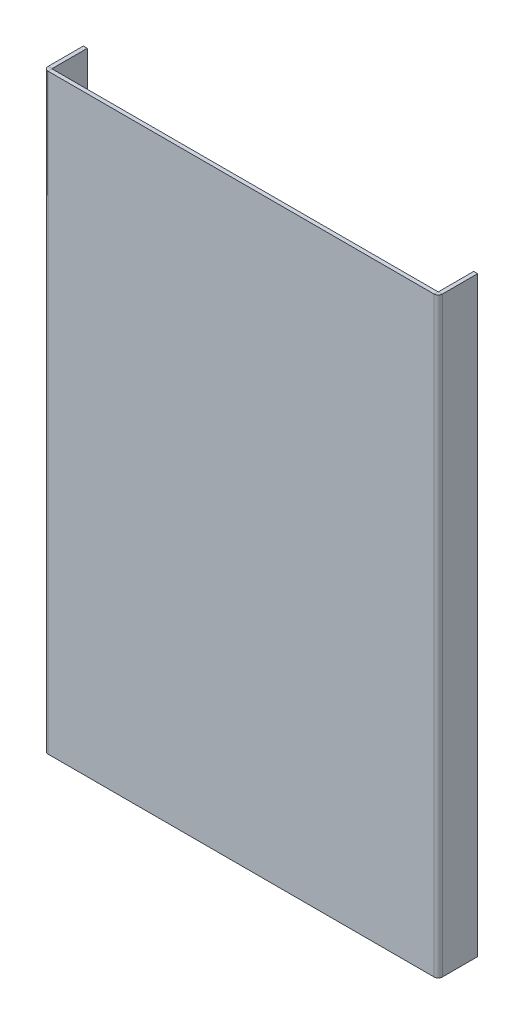
ISO-10303-21;
HEADER;
FILE_DESCRIPTION(('STEP AP214'),'2;1');
FILE_NAME('part.step','',(''),(''),'','','');
FILE_SCHEMA(('AUTOMOTIVE_DESIGN { 1 0 10303 214 1 1 1 1 }'));
ENDSEC;
DATA;
#1=APPLICATION_CONTEXT('core data for automotive mechanical design processes');
#2=APPLICATION_PROTOCOL_DEFINITION('international standard','automotive_design',2000,#1);
#3=PRODUCT_CONTEXT('',#1,'mechanical');
#4=PRODUCT('Part','Part','',(#3));
#5=PRODUCT_RELATED_PRODUCT_CATEGORY('part','',(#4));
#6=PRODUCT_DEFINITION_FORMATION('','',#4);
#7=PRODUCT_DEFINITION_CONTEXT('part definition',#1,'design');
#8=PRODUCT_DEFINITION('design','',#6,#7);
#9=PRODUCT_DEFINITION_SHAPE('','',#8);
#10=(LENGTH_UNIT() NAMED_UNIT(*) SI_UNIT(.MILLI.,.METRE.));
#11=(NAMED_UNIT(*) PLANE_ANGLE_UNIT() SI_UNIT($,.RADIAN.));
#12=(NAMED_UNIT(*) SI_UNIT($,.STERADIAN.) SOLID_ANGLE_UNIT());
#13=UNCERTAINTY_MEASURE_WITH_UNIT(LENGTH_MEASURE(1.E-05),#10,'distance_accuracy_value','');
#14=(GEOMETRIC_REPRESENTATION_CONTEXT(3) GLOBAL_UNCERTAINTY_ASSIGNED_CONTEXT((#13)) GLOBAL_UNIT_ASSIGNED_CONTEXT((#10,
#11,#12)) REPRESENTATION_CONTEXT('',''));
#15=CARTESIAN_POINT('',(0.,0.,0.));
#16=DIRECTION('',(0.,0.,1.));
#17=DIRECTION('',(1.,0.,0.));
#18=AXIS2_PLACEMENT_3D('',#15,#16,#17);
#19=CARTESIAN_POINT('',(0.,0.,-2.));
#20=DIRECTION('',(0.,0.,-1.));
#21=DIRECTION('',(-1.,0.,0.));
#22=AXIS2_PLACEMENT_3D('',#19,#20,#21);
#23=PLANE('',#22);
#24=DIRECTION('',(1.,0.,0.));
#25=VECTOR('',#24,1.);
#26=CARTESIAN_POINT('',(-100.,-150.,-2.));
#27=LINE('',#26,#25);
#28=CARTESIAN_POINT('',(-97.9,-150.,-2.));
#29=VERTEX_POINT('',#28);
#30=CARTESIAN_POINT('',(97.9,-150.,-2.));
#31=VERTEX_POINT('',#30);
#32=EDGE_CURVE('E13',#29,#31,#27,.T.);
#33=ORIENTED_EDGE('',*,*,#32,.F.);
#34=DIRECTION('',(0.,1.,0.));
#35=VECTOR('',#34,1.);
#36=CARTESIAN_POINT('',(-97.9,150.,-2.));
#37=LINE('',#36,#35);
#38=CARTESIAN_POINT('',(-97.9,150.,-2.));
#39=VERTEX_POINT('',#38);
#40=EDGE_CURVE('E244',#39,#29,#37,.F.);
#41=ORIENTED_EDGE('',*,*,#40,.F.);
#42=DIRECTION('',(-1.,0.,0.));
#43=VECTOR('',#42,1.);
#44=CARTESIAN_POINT('',(-100.,150.,-2.));
#45=LINE('',#44,#43);
#46=CARTESIAN_POINT('',(97.9,150.,-2.));
#47=VERTEX_POINT('',#46);
#48=EDGE_CURVE('E91',#47,#39,#45,.T.);
#49=ORIENTED_EDGE('',*,*,#48,.F.);
#50=DIRECTION('',(0.,-1.,0.));
#51=VECTOR('',#50,1.);
#52=CARTESIAN_POINT('',(97.9,-150.,-2.));
#53=LINE('',#52,#51);
#54=EDGE_CURVE('E319',#31,#47,#53,.F.);
#55=ORIENTED_EDGE('',*,*,#54,.F.);
#56=EDGE_LOOP('',(#33,#41,#49,#55));
#57=FACE_BOUND('',#56,.T.);
#58=ADVANCED_FACE('F81',(#57),#23,.T.);
#59=CARTESIAN_POINT('',(0.,0.,0.));
#60=DIRECTION('',(0.,0.,-1.));
#61=DIRECTION('',(-1.,0.,0.));
#62=AXIS2_PLACEMENT_3D('',#59,#60,#61);
#63=PLANE('',#62);
#64=DIRECTION('',(0.,1.,0.));
#65=VECTOR('',#64,1.);
#66=CARTESIAN_POINT('',(-97.9,150.,0.));
#67=LINE('',#66,#65);
#68=CARTESIAN_POINT('',(-97.9,150.,0.));
#69=VERTEX_POINT('',#68);
#70=CARTESIAN_POINT('',(-97.9,-150.,0.));
#71=VERTEX_POINT('',#70);
#72=EDGE_CURVE('E228',#69,#71,#67,.F.);
#73=ORIENTED_EDGE('',*,*,#72,.T.);
#74=DIRECTION('',(1.,0.,0.));
#75=VECTOR('',#74,1.);
#76=CARTESIAN_POINT('',(-100.,-150.,0.));
#77=LINE('',#76,#75);
#78=CARTESIAN_POINT('',(97.9,-150.,0.));
#79=VERTEX_POINT('',#78);
#80=EDGE_CURVE('E85',#71,#79,#77,.T.);
#81=ORIENTED_EDGE('',*,*,#80,.T.);
#82=DIRECTION('',(0.,-1.,0.));
#83=VECTOR('',#82,1.);
#84=CARTESIAN_POINT('',(97.9,-150.,0.));
#85=LINE('',#84,#83);
#86=CARTESIAN_POINT('',(97.9,150.,0.));
#87=VERTEX_POINT('',#86);
#88=EDGE_CURVE('E303',#79,#87,#85,.F.);
#89=ORIENTED_EDGE('',*,*,#88,.T.);
#90=DIRECTION('',(-1.,0.,0.));
#91=VECTOR('',#90,1.);
#92=CARTESIAN_POINT('',(-100.,150.,0.));
#93=LINE('',#92,#91);
#94=EDGE_CURVE('E328',#87,#69,#93,.T.);
#95=ORIENTED_EDGE('',*,*,#94,.T.);
#96=EDGE_LOOP('',(#73,#81,#89,#95));
#97=FACE_BOUND('',#96,.T.);
#98=ADVANCED_FACE('F338',(#97),#63,.F.);
#99=CARTESIAN_POINT('',(-100.,150.,-2.));
#100=DIRECTION('',(0.,1.,0.));
#101=DIRECTION('',(0.,0.,1.));
#102=AXIS2_PLACEMENT_3D('',#99,#100,#101);
#103=PLANE('',#102);
#104=ORIENTED_EDGE('',*,*,#48,.T.);
#105=DIRECTION('',(0.,0.,1.));
#106=VECTOR('',#105,1.);
#107=CARTESIAN_POINT('',(-97.9,150.,-2.));
#108=LINE('',#107,#106);
#109=EDGE_CURVE('E236',#39,#69,#108,.T.);
#110=ORIENTED_EDGE('',*,*,#109,.T.);
#111=ORIENTED_EDGE('',*,*,#94,.F.);
#112=DIRECTION('',(0.,0.,1.));
#113=VECTOR('',#112,1.);
#114=CARTESIAN_POINT('',(97.9,150.,-2.));
#115=LINE('',#114,#113);
#116=EDGE_CURVE('E99',#47,#87,#115,.T.);
#117=ORIENTED_EDGE('',*,*,#116,.F.);
#118=EDGE_LOOP('',(#104,#110,#111,#117));
#119=FACE_BOUND('',#118,.T.);
#120=ADVANCED_FACE('F83',(#119),#103,.T.);
#121=CARTESIAN_POINT('',(-100.,-150.,-2.));
#122=DIRECTION('',(0.,-1.,0.));
#123=DIRECTION('',(0.,0.,-1.));
#124=AXIS2_PLACEMENT_3D('',#121,#122,#123);
#125=PLANE('',#124);
#126=DIRECTION('',(0.,0.,1.));
#127=VECTOR('',#126,1.);
#128=CARTESIAN_POINT('',(-97.9,-150.,-2.));
#129=LINE('',#128,#127);
#130=EDGE_CURVE('E251',#29,#71,#129,.T.);
#131=ORIENTED_EDGE('',*,*,#130,.F.);
#132=ORIENTED_EDGE('',*,*,#32,.T.);
#133=DIRECTION('',(0.,0.,1.));
#134=VECTOR('',#133,1.);
#135=CARTESIAN_POINT('',(97.9,-150.,-2.));
#136=LINE('',#135,#134);
#137=EDGE_CURVE('E311',#31,#79,#136,.T.);
#138=ORIENTED_EDGE('',*,*,#137,.T.);
#139=ORIENTED_EDGE('',*,*,#80,.F.);
#140=EDGE_LOOP('',(#131,#132,#138,#139));
#141=FACE_BOUND('',#140,.T.);
#142=ADVANCED_FACE('F390',(#141),#125,.T.);
#143=CARTESIAN_POINT('',(97.9,150.,-2.1));
#144=DIRECTION('',(0.,1.,0.));
#145=DIRECTION('',(0.,0.,1.));
#146=AXIS2_PLACEMENT_3D('',#143,#144,#145);
#147=PLANE('',#146);
#148=DIRECTION('',(1.,0.,0.));
#149=VECTOR('',#148,1.);
#150=CARTESIAN_POINT('',(100.,150.,-2.1));
#151=LINE('',#150,#149);
#152=CARTESIAN_POINT('',(98.,150.,-2.1));
#153=VERTEX_POINT('',#152);
#154=CARTESIAN_POINT('',(100.,150.,-2.09999999999999));
#155=VERTEX_POINT('',#154);
#156=EDGE_CURVE('E255',#153,#155,#151,.T.);
#157=ORIENTED_EDGE('',*,*,#156,.F.);
#158=CARTESIAN_POINT('',(97.9,150.,-2.1));
#159=DIRECTION('',(0.,-1.,0.));
#160=DIRECTION('',(0.,0.,-1.));
#161=AXIS2_PLACEMENT_3D('',#158,#159,#160);
#162=CIRCLE('',#161,0.100000000000003);
#163=EDGE_CURVE('E315',#47,#153,#162,.F.);
#164=ORIENTED_EDGE('',*,*,#163,.F.);
#165=ORIENTED_EDGE('',*,*,#116,.T.);
#166=CARTESIAN_POINT('',(97.9,150.,-2.1));
#167=DIRECTION('',(0.,-1.,0.));
#168=DIRECTION('',(0.,0.,-1.));
#169=AXIS2_PLACEMENT_3D('',#166,#167,#168);
#170=CIRCLE('',#169,2.1);
#171=EDGE_CURVE('E306',#87,#155,#170,.F.);
#172=ORIENTED_EDGE('',*,*,#171,.T.);
#173=EDGE_LOOP('',(#157,#164,#165,#172));
#174=FACE_BOUND('',#173,.T.);
#175=ADVANCED_FACE('F365',(#174),#147,.T.);
#176=CARTESIAN_POINT('',(97.9,-150.,-2.1));
#177=DIRECTION('',(0.,1.,0.));
#178=DIRECTION('',(0.,0.,1.));
#179=AXIS2_PLACEMENT_3D('',#176,#177,#178);
#180=PLANE('',#179);
#181=CARTESIAN_POINT('',(97.9,-150.,-2.1));
#182=DIRECTION('',(0.,-1.,0.));
#183=DIRECTION('',(0.,0.,-1.));
#184=AXIS2_PLACEMENT_3D('',#181,#182,#183);
#185=CIRCLE('',#184,0.100000000000003);
#186=CARTESIAN_POINT('',(98.,-150.,-2.1));
#187=VERTEX_POINT('',#186);
#188=EDGE_CURVE('E262',#187,#31,#185,.T.);
#189=ORIENTED_EDGE('',*,*,#188,.F.);
#190=DIRECTION('',(1.,0.,0.));
#191=VECTOR('',#190,1.);
#192=CARTESIAN_POINT('',(98.,-150.,-2.09999999999999));
#193=LINE('',#192,#191);
#194=CARTESIAN_POINT('',(100.,-150.,-2.09999999999998));
#195=VERTEX_POINT('',#194);
#196=EDGE_CURVE('E293',#187,#195,#193,.T.);
#197=ORIENTED_EDGE('',*,*,#196,.T.);
#198=CARTESIAN_POINT('',(97.9,-150.,-2.1));
#199=DIRECTION('',(0.,-1.,0.));
#200=DIRECTION('',(0.,0.,-1.));
#201=AXIS2_PLACEMENT_3D('',#198,#199,#200);
#202=CIRCLE('',#201,2.1);
#203=EDGE_CURVE('E307',#195,#79,#202,.T.);
#204=ORIENTED_EDGE('',*,*,#203,.T.);
#205=ORIENTED_EDGE('',*,*,#137,.F.);
#206=EDGE_LOOP('',(#189,#197,#204,#205));
#207=FACE_BOUND('',#206,.T.);
#208=ADVANCED_FACE('F346',(#207),#180,.F.);
#209=CARTESIAN_POINT('',(97.9,-150.,-2.1));
#210=DIRECTION('',(0.,-1.,0.));
#211=DIRECTION('',(1.,0.,0.));
#212=AXIS2_PLACEMENT_3D('',#209,#210,#211);
#213=CYLINDRICAL_SURFACE('',#212,2.1);
#214=ORIENTED_EDGE('',*,*,#88,.F.);
#215=ORIENTED_EDGE('',*,*,#203,.F.);
#216=DIRECTION('',(0.,-1.,0.));
#217=VECTOR('',#216,1.);
#218=CARTESIAN_POINT('',(100.,0.,-2.09999999999999));
#219=LINE('',#218,#217);
#220=EDGE_CURVE('E289',#155,#195,#219,.T.);
#221=ORIENTED_EDGE('',*,*,#220,.F.);
#222=ORIENTED_EDGE('',*,*,#171,.F.);
#223=EDGE_LOOP('',(#214,#215,#221,#222));
#224=FACE_BOUND('',#223,.T.);
#225=ADVANCED_FACE('F342',(#224),#213,.T.);
#226=CARTESIAN_POINT('',(97.9,-150.,-2.1));
#227=DIRECTION('',(0.,-1.,0.));
#228=DIRECTION('',(1.,0.,0.));
#229=AXIS2_PLACEMENT_3D('',#226,#227,#228);
#230=CYLINDRICAL_SURFACE('',#229,0.100000000000003);
#231=ORIENTED_EDGE('',*,*,#54,.T.);
#232=ORIENTED_EDGE('',*,*,#163,.T.);
#233=DIRECTION('',(0.,1.,0.));
#234=VECTOR('',#233,1.);
#235=CARTESIAN_POINT('',(98.,150.,-2.1));
#236=LINE('',#235,#234);
#237=EDGE_CURVE('E297',#153,#187,#236,.F.);
#238=ORIENTED_EDGE('',*,*,#237,.T.);
#239=ORIENTED_EDGE('',*,*,#188,.T.);
#240=EDGE_LOOP('',(#231,#232,#238,#239));
#241=FACE_BOUND('',#240,.T.);
#242=ADVANCED_FACE('F368',(#241),#230,.F.);
#243=CARTESIAN_POINT('',(100.,-150.,-1.99999999999999));
#244=DIRECTION('',(0.,-1.,0.));
#245=DIRECTION('',(0.,0.,-1.));
#246=AXIS2_PLACEMENT_3D('',#243,#244,#245);
#247=PLANE('',#246);
#248=DIRECTION('',(0.,0.,1.));
#249=VECTOR('',#248,1.);
#250=CARTESIAN_POINT('',(100.,-150.,-1.99999999999999));
#251=LINE('',#250,#249);
#252=CARTESIAN_POINT('',(100.,-150.,-20.));
#253=VERTEX_POINT('',#252);
#254=EDGE_CURVE('E267',#253,#195,#251,.T.);
#255=ORIENTED_EDGE('',*,*,#254,.T.);
#256=ORIENTED_EDGE('',*,*,#196,.F.);
#257=DIRECTION('',(0.,0.,-1.));
#258=VECTOR('',#257,1.);
#259=CARTESIAN_POINT('',(98.,-150.,3.85494105772624E-13));
#260=LINE('',#259,#258);
#261=CARTESIAN_POINT('',(98.0000000000001,-150.,-20.));
#262=VERTEX_POINT('',#261);
#263=EDGE_CURVE('E278',#262,#187,#260,.F.);
#264=ORIENTED_EDGE('',*,*,#263,.F.);
#265=DIRECTION('',(-1.,0.,0.));
#266=VECTOR('',#265,1.);
#267=CARTESIAN_POINT('',(100.,-150.,-20.));
#268=LINE('',#267,#266);
#269=EDGE_CURVE('E259',#253,#262,#268,.T.);
#270=ORIENTED_EDGE('',*,*,#269,.F.);
#271=EDGE_LOOP('',(#255,#256,#264,#270));
#272=FACE_BOUND('',#271,.T.);
#273=ADVANCED_FACE('F355',(#272),#247,.T.);
#274=CARTESIAN_POINT('',(100.,150.,-20.));
#275=DIRECTION('',(0.,1.,0.));
#276=DIRECTION('',(0.,0.,1.));
#277=AXIS2_PLACEMENT_3D('',#274,#275,#276);
#278=PLANE('',#277);
#279=DIRECTION('',(0.,0.,1.));
#280=VECTOR('',#279,1.);
#281=CARTESIAN_POINT('',(98.,150.,3.85494105772624E-13));
#282=LINE('',#281,#280);
#283=CARTESIAN_POINT('',(98.0000000000001,150.,-20.));
#284=VERTEX_POINT('',#283);
#285=EDGE_CURVE('E286',#153,#284,#282,.F.);
#286=ORIENTED_EDGE('',*,*,#285,.F.);
#287=ORIENTED_EDGE('',*,*,#156,.T.);
#288=DIRECTION('',(0.,0.,-1.));
#289=VECTOR('',#288,1.);
#290=CARTESIAN_POINT('',(100.,150.,-20.));
#291=LINE('',#290,#289);
#292=CARTESIAN_POINT('',(100.,150.,-20.));
#293=VERTEX_POINT('',#292);
#294=EDGE_CURVE('E275',#155,#293,#291,.T.);
#295=ORIENTED_EDGE('',*,*,#294,.T.);
#296=DIRECTION('',(-1.,0.,0.));
#297=VECTOR('',#296,1.);
#298=CARTESIAN_POINT('',(100.,150.,-20.));
#299=LINE('',#298,#297);
#300=EDGE_CURVE('E263',#293,#284,#299,.T.);
#301=ORIENTED_EDGE('',*,*,#300,.T.);
#302=EDGE_LOOP('',(#286,#287,#295,#301));
#303=FACE_BOUND('',#302,.T.);
#304=ADVANCED_FACE('F362',(#303),#278,.T.);
#305=CARTESIAN_POINT('',(100.,0.,3.9247706845031E-13));
#306=DIRECTION('',(1.,0.,0.));
#307=DIRECTION('',(0.,0.,-1.));
#308=AXIS2_PLACEMENT_3D('',#305,#306,#307);
#309=PLANE('',#308);
#310=ORIENTED_EDGE('',*,*,#294,.F.);
#311=ORIENTED_EDGE('',*,*,#220,.T.);
#312=ORIENTED_EDGE('',*,*,#254,.F.);
#313=DIRECTION('',(0.,-1.,0.));
#314=VECTOR('',#313,1.);
#315=CARTESIAN_POINT('',(100.,-150.,-20.));
#316=LINE('',#315,#314);
#317=EDGE_CURVE('E271',#293,#253,#316,.T.);
#318=ORIENTED_EDGE('',*,*,#317,.F.);
#319=EDGE_LOOP('',(#310,#311,#312,#318));
#320=FACE_BOUND('',#319,.T.);
#321=ADVANCED_FACE('F353',(#320),#309,.T.);
#322=CARTESIAN_POINT('',(98.,0.,3.85494105772624E-13));
#323=DIRECTION('',(1.,0.,0.));
#324=DIRECTION('',(0.,0.,-1.));
#325=AXIS2_PLACEMENT_3D('',#322,#323,#324);
#326=PLANE('',#325);
#327=ORIENTED_EDGE('',*,*,#237,.F.);
#328=ORIENTED_EDGE('',*,*,#285,.T.);
#329=DIRECTION('',(0.,1.,0.));
#330=VECTOR('',#329,1.);
#331=CARTESIAN_POINT('',(98.0000000000001,0.,-20.));
#332=LINE('',#331,#330);
#333=EDGE_CURVE('E282',#284,#262,#332,.F.);
#334=ORIENTED_EDGE('',*,*,#333,.T.);
#335=ORIENTED_EDGE('',*,*,#263,.T.);
#336=EDGE_LOOP('',(#327,#328,#334,#335));
#337=FACE_BOUND('',#336,.T.);
#338=ADVANCED_FACE('F370',(#337),#326,.F.);
#339=CARTESIAN_POINT('',(100.,-150.,-20.));
#340=DIRECTION('',(0.,0.,-1.));
#341=DIRECTION('',(-1.,0.,0.));
#342=AXIS2_PLACEMENT_3D('',#339,#340,#341);
#343=PLANE('',#342);
#344=ORIENTED_EDGE('',*,*,#333,.F.);
#345=ORIENTED_EDGE('',*,*,#300,.F.);
#346=ORIENTED_EDGE('',*,*,#317,.T.);
#347=ORIENTED_EDGE('',*,*,#269,.T.);
#348=EDGE_LOOP('',(#344,#345,#346,#347));
#349=FACE_BOUND('',#348,.T.);
#350=ADVANCED_FACE('F359',(#349),#343,.T.);
#351=CARTESIAN_POINT('',(-97.9,-150.,-2.1));
#352=DIRECTION('',(0.,-1.,0.));
#353=DIRECTION('',(0.,0.,-1.));
#354=AXIS2_PLACEMENT_3D('',#351,#352,#353);
#355=PLANE('',#354);
#356=DIRECTION('',(-1.,0.,0.));
#357=VECTOR('',#356,1.);
#358=CARTESIAN_POINT('',(-100.,-150.,-2.1));
#359=LINE('',#358,#357);
#360=CARTESIAN_POINT('',(-98.,-150.,-2.1));
#361=VERTEX_POINT('',#360);
#362=CARTESIAN_POINT('',(-100.,-150.,-2.1));
#363=VERTEX_POINT('',#362);
#364=EDGE_CURVE('E224',#361,#363,#359,.T.);
#365=ORIENTED_EDGE('',*,*,#364,.F.);
#366=CARTESIAN_POINT('',(-97.9,-150.,-2.1));
#367=DIRECTION('',(0.,1.,0.));
#368=DIRECTION('',(0.,0.,1.));
#369=AXIS2_PLACEMENT_3D('',#366,#367,#368);
#370=CIRCLE('',#369,0.100000000000003);
#371=EDGE_CURVE('E240',#29,#361,#370,.F.);
#372=ORIENTED_EDGE('',*,*,#371,.F.);
#373=ORIENTED_EDGE('',*,*,#130,.T.);
#374=CARTESIAN_POINT('',(-97.9,-150.,-2.1));
#375=DIRECTION('',(0.,1.,0.));
#376=DIRECTION('',(0.,0.,1.));
#377=AXIS2_PLACEMENT_3D('',#374,#375,#376);
#378=CIRCLE('',#377,2.1);
#379=EDGE_CURVE('E231',#71,#363,#378,.F.);
#380=ORIENTED_EDGE('',*,*,#379,.T.);
#381=EDGE_LOOP('',(#365,#372,#373,#380));
#382=FACE_BOUND('',#381,.T.);
#383=ADVANCED_FACE('F377',(#382),#355,.T.);
#384=CARTESIAN_POINT('',(-97.9,150.,-2.1));
#385=DIRECTION('',(0.,-1.,0.));
#386=DIRECTION('',(0.,0.,-1.));
#387=AXIS2_PLACEMENT_3D('',#384,#385,#386);
#388=PLANE('',#387);
#389=CARTESIAN_POINT('',(-97.9,150.,-2.1));
#390=DIRECTION('',(0.,1.,0.));
#391=DIRECTION('',(0.,0.,1.));
#392=AXIS2_PLACEMENT_3D('',#389,#390,#391);
#393=CIRCLE('',#392,0.100000000000003);
#394=CARTESIAN_POINT('',(-98.,150.,-2.1));
#395=VERTEX_POINT('',#394);
#396=EDGE_CURVE('E185',#395,#39,#393,.T.);
#397=ORIENTED_EDGE('',*,*,#396,.F.);
#398=DIRECTION('',(-1.,0.,0.));
#399=VECTOR('',#398,1.);
#400=CARTESIAN_POINT('',(-98.,150.,-2.1));
#401=LINE('',#400,#399);
#402=CARTESIAN_POINT('',(-100.,150.,-2.1));
#403=VERTEX_POINT('',#402);
#404=EDGE_CURVE('E217',#395,#403,#401,.T.);
#405=ORIENTED_EDGE('',*,*,#404,.T.);
#406=CARTESIAN_POINT('',(-97.9,150.,-2.1));
#407=DIRECTION('',(0.,1.,0.));
#408=DIRECTION('',(0.,0.,1.));
#409=AXIS2_PLACEMENT_3D('',#406,#407,#408);
#410=CIRCLE('',#409,2.1);
#411=EDGE_CURVE('E232',#403,#69,#410,.T.);
#412=ORIENTED_EDGE('',*,*,#411,.T.);
#413=ORIENTED_EDGE('',*,*,#109,.F.);
#414=EDGE_LOOP('',(#397,#405,#412,#413));
#415=FACE_BOUND('',#414,.T.);
#416=ADVANCED_FACE('F410',(#415),#388,.F.);
#417=CARTESIAN_POINT('',(-97.9,150.,-2.1));
#418=DIRECTION('',(0.,1.,0.));
#419=DIRECTION('',(-1.,0.,0.));
#420=AXIS2_PLACEMENT_3D('',#417,#418,#419);
#421=CYLINDRICAL_SURFACE('',#420,2.1);
#422=ORIENTED_EDGE('',*,*,#72,.F.);
#423=ORIENTED_EDGE('',*,*,#411,.F.);
#424=DIRECTION('',(0.,1.,0.));
#425=VECTOR('',#424,1.);
#426=CARTESIAN_POINT('',(-100.,-150.,-2.1));
#427=LINE('',#426,#425);
#428=EDGE_CURVE('E194',#403,#363,#427,.F.);
#429=ORIENTED_EDGE('',*,*,#428,.T.);
#430=ORIENTED_EDGE('',*,*,#379,.F.);
#431=EDGE_LOOP('',(#422,#423,#429,#430));
#432=FACE_BOUND('',#431,.T.);
#433=ADVANCED_FACE('F412',(#432),#421,.T.);
#434=CARTESIAN_POINT('',(-97.9,150.,-2.1));
#435=DIRECTION('',(0.,1.,0.));
#436=DIRECTION('',(-1.,0.,0.));
#437=AXIS2_PLACEMENT_3D('',#434,#435,#436);
#438=CYLINDRICAL_SURFACE('',#437,0.100000000000003);
#439=ORIENTED_EDGE('',*,*,#40,.T.);
#440=ORIENTED_EDGE('',*,*,#371,.T.);
#441=DIRECTION('',(0.,1.,0.));
#442=VECTOR('',#441,1.);
#443=CARTESIAN_POINT('',(-98.,-150.,-2.1));
#444=LINE('',#443,#442);
#445=EDGE_CURVE('E221',#361,#395,#444,.T.);
#446=ORIENTED_EDGE('',*,*,#445,.T.);
#447=ORIENTED_EDGE('',*,*,#396,.T.);
#448=EDGE_LOOP('',(#439,#440,#446,#447));
#449=FACE_BOUND('',#448,.T.);
#450=ADVANCED_FACE('F400',(#449),#438,.F.);
#451=CARTESIAN_POINT('',(-100.,-150.,-1.99999999999999));
#452=DIRECTION('',(0.,-1.,0.));
#453=DIRECTION('',(0.,0.,-1.));
#454=AXIS2_PLACEMENT_3D('',#451,#452,#453);
#455=PLANE('',#454);
#456=DIRECTION('',(0.,0.,-1.));
#457=VECTOR('',#456,1.);
#458=CARTESIAN_POINT('',(-98.,-150.,3.85494105772624E-13));
#459=LINE('',#458,#457);
#460=CARTESIAN_POINT('',(-98.0000000000001,-150.,-20.));
#461=VERTEX_POINT('',#460);
#462=EDGE_CURVE('E212',#361,#461,#459,.T.);
#463=ORIENTED_EDGE('',*,*,#462,.F.);
#464=ORIENTED_EDGE('',*,*,#364,.T.);
#465=DIRECTION('',(0.,0.,1.));
#466=VECTOR('',#465,1.);
#467=CARTESIAN_POINT('',(-100.,-150.,-1.99999999999999));
#468=LINE('',#467,#466);
#469=CARTESIAN_POINT('',(-100.,-150.,-20.));
#470=VERTEX_POINT('',#469);
#471=EDGE_CURVE('E201',#363,#470,#468,.F.);
#472=ORIENTED_EDGE('',*,*,#471,.T.);
#473=DIRECTION('',(1.,0.,0.));
#474=VECTOR('',#473,1.);
#475=CARTESIAN_POINT('',(-100.,-150.,-20.));
#476=LINE('',#475,#474);
#477=EDGE_CURVE('E186',#470,#461,#476,.T.);
#478=ORIENTED_EDGE('',*,*,#477,.T.);
#479=EDGE_LOOP('',(#463,#464,#472,#478));
#480=FACE_BOUND('',#479,.T.);
#481=ADVANCED_FACE('F405',(#480),#455,.T.);
#482=CARTESIAN_POINT('',(-100.,150.,-20.));
#483=DIRECTION('',(0.,1.,0.));
#484=DIRECTION('',(0.,0.,1.));
#485=AXIS2_PLACEMENT_3D('',#482,#483,#484);
#486=PLANE('',#485);
#487=DIRECTION('',(0.,0.,-1.));
#488=VECTOR('',#487,1.);
#489=CARTESIAN_POINT('',(-100.,150.,-20.));
#490=LINE('',#489,#488);
#491=CARTESIAN_POINT('',(-100.,150.,-20.));
#492=VERTEX_POINT('',#491);
#493=EDGE_CURVE('E177',#492,#403,#490,.F.);
#494=ORIENTED_EDGE('',*,*,#493,.T.);
#495=ORIENTED_EDGE('',*,*,#404,.F.);
#496=DIRECTION('',(0.,0.,1.));
#497=VECTOR('',#496,1.);
#498=CARTESIAN_POINT('',(-98.,150.,3.85494105772624E-13));
#499=LINE('',#498,#497);
#500=CARTESIAN_POINT('',(-98.0000000000001,150.,-20.));
#501=VERTEX_POINT('',#500);
#502=EDGE_CURVE('E179',#501,#395,#499,.T.);
#503=ORIENTED_EDGE('',*,*,#502,.F.);
#504=DIRECTION('',(1.,0.,0.));
#505=VECTOR('',#504,1.);
#506=CARTESIAN_POINT('',(-100.,150.,-20.));
#507=LINE('',#506,#505);
#508=EDGE_CURVE('E173',#492,#501,#507,.T.);
#509=ORIENTED_EDGE('',*,*,#508,.F.);
#510=EDGE_LOOP('',(#494,#495,#503,#509));
#511=FACE_BOUND('',#510,.T.);
#512=ADVANCED_FACE('F175',(#511),#486,.T.);
#513=CARTESIAN_POINT('',(-100.,0.,3.9247706845031E-13));
#514=DIRECTION('',(1.,0.,0.));
#515=DIRECTION('',(0.,0.,-1.));
#516=AXIS2_PLACEMENT_3D('',#513,#514,#515);
#517=PLANE('',#516);
#518=ORIENTED_EDGE('',*,*,#428,.F.);
#519=ORIENTED_EDGE('',*,*,#493,.F.);
#520=DIRECTION('',(0.,-1.,0.));
#521=VECTOR('',#520,1.);
#522=CARTESIAN_POINT('',(-100.,-150.,-20.));
#523=LINE('',#522,#521);
#524=EDGE_CURVE('E193',#470,#492,#523,.F.);
#525=ORIENTED_EDGE('',*,*,#524,.F.);
#526=ORIENTED_EDGE('',*,*,#471,.F.);
#527=EDGE_LOOP('',(#518,#519,#525,#526));
#528=FACE_BOUND('',#527,.T.);
#529=ADVANCED_FACE('F191',(#528),#517,.F.);
#530=CARTESIAN_POINT('',(-98.,0.,3.85494105772624E-13));
#531=DIRECTION('',(1.,0.,0.));
#532=DIRECTION('',(0.,0.,-1.));
#533=AXIS2_PLACEMENT_3D('',#530,#531,#532);
#534=PLANE('',#533);
#535=ORIENTED_EDGE('',*,*,#502,.T.);
#536=ORIENTED_EDGE('',*,*,#445,.F.);
#537=ORIENTED_EDGE('',*,*,#462,.T.);
#538=DIRECTION('',(0.,1.,0.));
#539=VECTOR('',#538,1.);
#540=CARTESIAN_POINT('',(-98.0000000000001,0.,-20.));
#541=LINE('',#540,#539);
#542=EDGE_CURVE('E209',#461,#501,#541,.T.);
#543=ORIENTED_EDGE('',*,*,#542,.T.);
#544=EDGE_LOOP('',(#535,#536,#537,#543));
#545=FACE_BOUND('',#544,.T.);
#546=ADVANCED_FACE('F407',(#545),#534,.T.);
#547=CARTESIAN_POINT('',(-100.,-150.,-20.));
#548=DIRECTION('',(0.,0.,-1.));
#549=DIRECTION('',(-1.,0.,0.));
#550=AXIS2_PLACEMENT_3D('',#547,#548,#549);
#551=PLANE('',#550);
#552=ORIENTED_EDGE('',*,*,#542,.F.);
#553=ORIENTED_EDGE('',*,*,#477,.F.);
#554=ORIENTED_EDGE('',*,*,#524,.T.);
#555=ORIENTED_EDGE('',*,*,#508,.T.);
#556=EDGE_LOOP('',(#552,#553,#554,#555));
#557=FACE_BOUND('',#556,.T.);
#558=ADVANCED_FACE('F198',(#557),#551,.T.);
#559=CLOSED_SHELL('',(#58,#98,#120,#142,#175,#208,#225,#242,#273,#304,#321,#338,#350,#383,#416,
#433,#450,#481,#512,#529,#546,#558));
#560=MANIFOLD_SOLID_BREP('B2',#559);
#561=ADVANCED_BREP_SHAPE_REPRESENTATION('',(#18,#560),#14);
#562=SHAPE_DEFINITION_REPRESENTATION(#9,#561);
ENDSEC;
END-ISO-10303-21;
